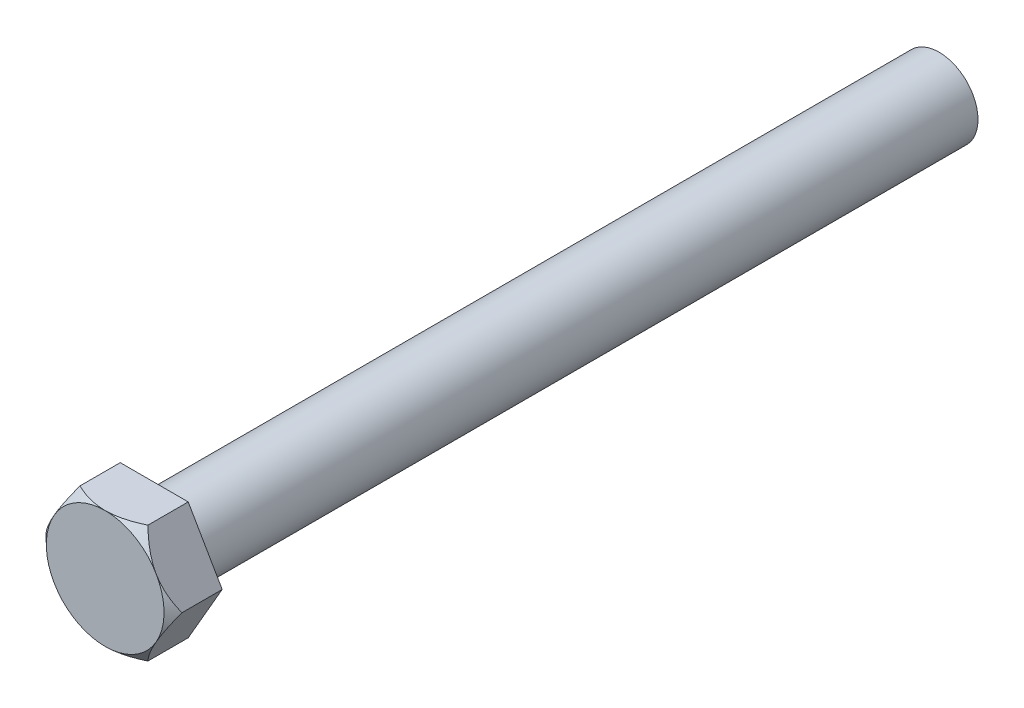
ISO-10303-21;
HEADER;
FILE_DESCRIPTION(('STEP AP214'),'2;1');
FILE_NAME('part.step','',(''),(''),'','','');
FILE_SCHEMA(('AUTOMOTIVE_DESIGN { 1 0 10303 214 1 1 1 1 }'));
ENDSEC;
DATA;
#1=APPLICATION_CONTEXT('core data for automotive mechanical design processes');
#2=APPLICATION_PROTOCOL_DEFINITION('international standard','automotive_design',2000,#1);
#3=PRODUCT_CONTEXT('',#1,'mechanical');
#4=PRODUCT('Part','Part','',(#3));
#5=PRODUCT_RELATED_PRODUCT_CATEGORY('part','',(#4));
#6=PRODUCT_DEFINITION_FORMATION('','',#4);
#7=PRODUCT_DEFINITION_CONTEXT('part definition',#1,'design');
#8=PRODUCT_DEFINITION('design','',#6,#7);
#9=PRODUCT_DEFINITION_SHAPE('','',#8);
#10=(LENGTH_UNIT() NAMED_UNIT(*) SI_UNIT(.MILLI.,.METRE.));
#11=(NAMED_UNIT(*) PLANE_ANGLE_UNIT() SI_UNIT($,.RADIAN.));
#12=(NAMED_UNIT(*) SI_UNIT($,.STERADIAN.) SOLID_ANGLE_UNIT());
#13=UNCERTAINTY_MEASURE_WITH_UNIT(LENGTH_MEASURE(1.E-05),#10,'distance_accuracy_value','');
#14=(GEOMETRIC_REPRESENTATION_CONTEXT(3) GLOBAL_UNCERTAINTY_ASSIGNED_CONTEXT((#13)) GLOBAL_UNIT_ASSIGNED_CONTEXT((#10,
#11,#12)) REPRESENTATION_CONTEXT('',''));
#15=CARTESIAN_POINT('',(0.,0.,0.));
#16=DIRECTION('',(0.,0.,1.));
#17=DIRECTION('',(1.,0.,0.));
#18=AXIS2_PLACEMENT_3D('',#15,#16,#17);
#19=CARTESIAN_POINT('',(6.92820323027552,-12.,170.));
#20=DIRECTION('',(-0.866025403784439,0.5,0.));
#21=DIRECTION('',(-0.5,-0.866025403784439,0.));
#22=AXIS2_PLACEMENT_3D('',#19,#20,#21);
#23=PLANE('',#22);
#24=CARTESIAN_POINT('',(6.92808776022168,-12.0002,168.207177610038));
#25=CARTESIAN_POINT('',(7.05087001299984,-11.7875348999205,168.325729546983));
#26=CARTESIAN_POINT('',(7.17459054592487,-11.5732446509548,168.440500104371));
#27=CARTESIAN_POINT('',(7.42404993886838,-11.1411683079514,168.661273699565));
#28=CARTESIAN_POINT('',(7.54978987656138,-10.9233803473265,168.767271856794));
#29=CARTESIAN_POINT('',(7.80400293306077,-10.4830704175222,168.969726409275));
#30=CARTESIAN_POINT('',(7.93248740222282,-10.26052878895,169.066126145696));
#31=CARTESIAN_POINT('',(8.19148908269136,-9.81192471913279,169.247228171248));
#32=CARTESIAN_POINT('',(8.32200597250958,-9.58586283472178,169.33193228989));
#33=CARTESIAN_POINT('',(8.58288800793269,-9.13400189458696,169.486857477345));
#34=CARTESIAN_POINT('',(8.71322149491538,-8.90825767320533,169.557290549802));
#35=CARTESIAN_POINT('',(8.97560825981543,-8.45379046516481,169.683880327818));
#36=CARTESIAN_POINT('',(9.10766135418737,-8.22506779641592,169.74003854411));
#37=CARTESIAN_POINT('',(9.37290127394448,-7.76565877920112,169.836620557546));
#38=CARTESIAN_POINT('',(9.5060848891701,-7.53497799089464,169.877079389886));
#39=CARTESIAN_POINT('',(9.77344868899965,-7.07189030548519,169.941337735658));
#40=CARTESIAN_POINT('',(9.90762873430441,-6.83948364965544,169.965139535));
#41=CARTESIAN_POINT('',(10.1405120917843,-6.43611784226304,169.991356233011));
#42=CARTESIAN_POINT('',(10.2391064268982,-6.26534744450722,169.997788383698));
#43=CARTESIAN_POINT('',(10.4363455583565,-5.92371924758081,170.001252755064));
#44=CARTESIAN_POINT('',(10.5349903576166,-5.7528614433598,169.998284351577));
#45=CARTESIAN_POINT('',(10.7321275696726,-5.41140977601644,169.982987710216));
#46=CARTESIAN_POINT('',(10.8306199286678,-5.24081600607944,169.970656699812));
#47=CARTESIAN_POINT('',(11.0272146701379,-4.90030392535227,169.936836945066));
#48=CARTESIAN_POINT('',(11.1253170065454,-4.73038569435331,169.915347149576));
#49=CARTESIAN_POINT('',(11.4189264840233,-4.22183916177778,169.837549839052));
#50=CARTESIAN_POINT('',(11.6135815060493,-3.88468677368039,169.767927203115));
#51=CARTESIAN_POINT('',(11.999290278374,-3.21661958308889,169.597054888879));
#52=CARTESIAN_POINT('',(12.1903443843722,-2.88570416450543,169.495808351943));
#53=CARTESIAN_POINT('',(12.5064490392381,-2.33819484176873,169.30387990913));
#54=CARTESIAN_POINT('',(12.6326424708313,-2.11962140666769,169.220579994964));
#55=CARTESIAN_POINT('',(12.8830943562106,-1.6858260163394,169.04315927892));
#56=CARTESIAN_POINT('',(13.0073530357845,-1.47060367003597,168.949039750614));
#57=CARTESIAN_POINT('',(13.253503394551,-1.04425874235103,168.751656153364));
#58=CARTESIAN_POINT('',(13.3754020440447,-0.833124088053984,168.648426622953));
#59=CARTESIAN_POINT('',(13.6173347865059,-0.414084286096656,168.433710650121));
#60=CARTESIAN_POINT('',(13.7373693355508,-0.206178348487363,168.322226267126));
#61=CARTESIAN_POINT('',(13.8565219306049,0.000200000000005602,168.207177610038));
#62=B_SPLINE_CURVE_WITH_KNOTS('',3,(#24,#25,#26,#27,#28,#29,#30,#31,#32,#33,#34,#35,#36,#37,#38,
#39,#40,#41,#42,#43,#44,#45,#46,#47,#48,#49,#50,#51,#52,#53,#54,#55,#56,#57,#58,#59,#60,#61),
.UNSPECIFIED.,.F.,.F.,(4,2,2,2,2,2,2,2,2,2,2,2,2,2,2,2,2,2,4),(0.,0.818087409395662,
1.63662694915712,2.45974274618354,3.28272963931715,4.09241162198263,4.90200787883344,
5.70978688161754,6.51745500800844,7.10912570284194,7.70083568348206,8.29272095437571,
8.88467417389757,10.0695053785687,11.2542189253583,12.0513090708619,12.8483054870288,
13.6424004016194,14.4362978680748),.UNSPECIFIED.);
#63=CARTESIAN_POINT('',(6.92820323027552,-12.,168.207289119567));
#64=VERTEX_POINT('',#63);
#65=CARTESIAN_POINT('',(10.3923048454133,-6.,170.));
#66=VERTEX_POINT('',#65);
#67=EDGE_CURVE('E170',#64,#66,#62,.T.);
#68=ORIENTED_EDGE('',*,*,#67,.F.);
#69=DIRECTION('',(0.,0.,-1.));
#70=VECTOR('',#69,1.);
#71=CARTESIAN_POINT('',(6.92820323027552,-12.,170.));
#72=LINE('',#71,#70);
#73=CARTESIAN_POINT('',(6.92820323027552,-12.,160.));
#74=VERTEX_POINT('',#73);
#75=EDGE_CURVE('E189',#64,#74,#72,.T.);
#76=ORIENTED_EDGE('',*,*,#75,.T.);
#77=DIRECTION('',(0.5,0.866025403784439,0.));
#78=VECTOR('',#77,1.);
#79=CARTESIAN_POINT('',(6.92820323027552,-12.,160.));
#80=LINE('',#79,#78);
#81=CARTESIAN_POINT('',(13.856406460551,0.,160.));
#82=VERTEX_POINT('',#81);
#83=EDGE_CURVE('E172',#74,#82,#80,.T.);
#84=ORIENTED_EDGE('',*,*,#83,.T.);
#85=DIRECTION('',(0.,0.,-1.));
#86=VECTOR('',#85,1.);
#87=CARTESIAN_POINT('',(13.856406460551,0.,170.));
#88=LINE('',#87,#86);
#89=CARTESIAN_POINT('',(13.856406460551,0.,168.207289119567));
#90=VERTEX_POINT('',#89);
#91=EDGE_CURVE('E198',#90,#82,#88,.T.);
#92=ORIENTED_EDGE('',*,*,#91,.F.);
#93=EDGE_CURVE('E165',#66,#90,#62,.T.);
#94=ORIENTED_EDGE('',*,*,#93,.F.);
#95=EDGE_LOOP('',(#68,#76,#84,#92,#94));
#96=FACE_BOUND('',#95,.T.);
#97=ADVANCED_FACE('F33',(#96),#23,.F.);
#98=CARTESIAN_POINT('',(13.856406460551,0.,170.));
#99=DIRECTION('',(-0.866025403784438,-0.5,0.));
#100=DIRECTION('',(0.5,-0.866025403784438,0.));
#101=AXIS2_PLACEMENT_3D('',#98,#99,#100);
#102=PLANE('',#101);
#103=CARTESIAN_POINT('',(13.8565219306049,-0.000200000000006842,168.207177610038));
#104=CARTESIAN_POINT('',(13.7337396778267,0.212465100079519,168.325729546983));
#105=CARTESIAN_POINT('',(13.6100191449017,0.426755349045171,168.440500104371));
#106=CARTESIAN_POINT('',(13.3605597519582,0.858831692048625,168.661273699565));
#107=CARTESIAN_POINT('',(13.2348198142652,1.07661965267345,168.767271856794));
#108=CARTESIAN_POINT('',(12.9806067577658,1.51692958247778,168.969726409275));
#109=CARTESIAN_POINT('',(12.8521222886037,1.73947121104996,169.066126145696));
#110=CARTESIAN_POINT('',(12.5931206081352,2.1880752808672,169.247228171248));
#111=CARTESIAN_POINT('',(12.462603718317,2.41413716527821,169.33193228989));
#112=CARTESIAN_POINT('',(12.2017216828938,2.86599810541303,169.486857477345));
#113=CARTESIAN_POINT('',(12.0713881959112,3.09174232679466,169.557290549802));
#114=CARTESIAN_POINT('',(11.8090014310111,3.54620953483518,169.683880327818));
#115=CARTESIAN_POINT('',(11.6769483366392,3.77493220358407,169.74003854411));
#116=CARTESIAN_POINT('',(11.4117084168821,4.23434122079888,169.836620557546));
#117=CARTESIAN_POINT('',(11.2785248016564,4.46502200910536,169.877079389886));
#118=CARTESIAN_POINT('',(11.0111610018269,4.92810969451481,169.941337735658));
#119=CARTESIAN_POINT('',(10.8769809565221,5.16051635034456,169.965139535));
#120=CARTESIAN_POINT('',(10.6440975990422,5.56388215773696,169.991356233011));
#121=CARTESIAN_POINT('',(10.5455032639283,5.73465255549278,169.997788383698));
#122=CARTESIAN_POINT('',(10.3482641324701,6.07628075241919,170.001252755064));
#123=CARTESIAN_POINT('',(10.2496193332099,6.24713855664019,169.998284351577));
#124=CARTESIAN_POINT('',(10.052482121154,6.58859022398356,169.982987710216));
#125=CARTESIAN_POINT('',(9.95398976215877,6.75918399392056,169.970656699812));
#126=CARTESIAN_POINT('',(9.75739502068862,7.09969607464773,169.936836945066));
#127=CARTESIAN_POINT('',(9.65929268428115,7.26961430564668,169.915347149576));
#128=CARTESIAN_POINT('',(9.36568320680322,7.77816083822222,169.837549839052));
#129=CARTESIAN_POINT('',(9.17102818477726,8.11531322631961,169.767927203115));
#130=CARTESIAN_POINT('',(8.7853194124525,8.78338041691111,169.597054888879));
#131=CARTESIAN_POINT('',(8.59426530645435,9.11429583549456,169.495808351943));
#132=CARTESIAN_POINT('',(8.27816065158848,9.66180515823126,169.30387990913));
#133=CARTESIAN_POINT('',(8.15196721999519,9.88037859333231,169.220579994964));
#134=CARTESIAN_POINT('',(7.90151533461593,10.3141739836606,169.04315927892));
#135=CARTESIAN_POINT('',(7.77725665504203,10.529396329964,168.949039750615));
#136=CARTESIAN_POINT('',(7.5311062962755,10.955741257649,168.751656153364));
#137=CARTESIAN_POINT('',(7.40920764678184,11.166875911946,168.648426622953));
#138=CARTESIAN_POINT('',(7.16727490432061,11.5859157139033,168.433710650121));
#139=CARTESIAN_POINT('',(7.04724035527576,11.7938216515126,168.322226267126));
#140=CARTESIAN_POINT('',(6.92808776022167,12.0002,168.207177610038));
#141=B_SPLINE_CURVE_WITH_KNOTS('',3,(#103,#104,#105,#106,#107,#108,#109,#110,#111,#112,#113,
#114,#115,#116,#117,#118,#119,#120,#121,#122,#123,#124,#125,#126,#127,#128,#129,#130,#131,#132,
#133,#134,#135,#136,#137,#138,#139,#140),.UNSPECIFIED.,.F.,.F.,(4,2,2,2,2,2,2,2,2,2,2,2,2,2,2,2,
2,2,4),(0.,0.818087409395676,1.63662694915714,2.45974274618355,3.28272963931717,
4.09241162198265,4.90200787883346,5.70978688161756,6.51745500800847,7.10912570284197,
7.70083568348208,8.29272095437573,8.88467417389759,10.0695053785687,11.2542189253583,
12.0513090708619,12.8483054870288,13.6424004016194,14.4362978680748),.UNSPECIFIED.);
#142=CARTESIAN_POINT('',(10.3923048454133,6.,170.));
#143=VERTEX_POINT('',#142);
#144=EDGE_CURVE('E171',#90,#143,#141,.T.);
#145=ORIENTED_EDGE('',*,*,#144,.F.);
#146=ORIENTED_EDGE('',*,*,#91,.T.);
#147=DIRECTION('',(-0.5,0.866025403784439,0.));
#148=VECTOR('',#147,1.);
#149=CARTESIAN_POINT('',(13.856406460551,0.,160.));
#150=LINE('',#149,#148);
#151=CARTESIAN_POINT('',(6.9282032302755,12.,160.));
#152=VERTEX_POINT('',#151);
#153=EDGE_CURVE('E175',#82,#152,#150,.T.);
#154=ORIENTED_EDGE('',*,*,#153,.T.);
#155=DIRECTION('',(0.,0.,-1.));
#156=VECTOR('',#155,1.);
#157=CARTESIAN_POINT('',(6.9282032302755,12.,170.));
#158=LINE('',#157,#156);
#159=CARTESIAN_POINT('',(6.92820323027551,12.,168.207289119567));
#160=VERTEX_POINT('',#159);
#161=EDGE_CURVE('E196',#160,#152,#158,.T.);
#162=ORIENTED_EDGE('',*,*,#161,.F.);
#163=EDGE_CURVE('E109',#143,#160,#141,.T.);
#164=ORIENTED_EDGE('',*,*,#163,.F.);
#165=EDGE_LOOP('',(#145,#146,#154,#162,#164));
#166=FACE_BOUND('',#165,.T.);
#167=ADVANCED_FACE('F154',(#166),#102,.F.);
#168=CARTESIAN_POINT('',(6.9282032302755,12.,170.));
#169=DIRECTION('',(0.,-1.,0.));
#170=DIRECTION('',(0.,0.,-1.));
#171=AXIS2_PLACEMENT_3D('',#168,#169,#170);
#172=PLANE('',#171);
#173=CARTESIAN_POINT('',(-17.2429105362062,12.,161.301491533726));
#174=CARTESIAN_POINT('',(-17.0230654007389,12.,161.475744655455));
#175=CARTESIAN_POINT('',(-16.8026944880091,12.,161.649334249678));
#176=CARTESIAN_POINT('',(-16.3607959575137,12.,161.995041135547));
#177=CARTESIAN_POINT('',(-16.1392683230899,12.,162.167158405894));
#178=CARTESIAN_POINT('',(-15.4726945958689,12.,162.681159267231));
#179=CARTESIAN_POINT('',(-15.0257640195892,12.,163.020607399545));
#180=CARTESIAN_POINT('',(-14.1210091275293,12.,163.695136903427));
#181=CARTESIAN_POINT('',(-13.6631191836772,12.,164.030130488567));
#182=CARTESIAN_POINT('',(-12.740002807525,12.,164.689779507659));
#183=CARTESIAN_POINT('',(-12.274777073298,12.,165.014435916524));
#184=CARTESIAN_POINT('',(-11.2940434821539,12.,165.678638448745));
#185=CARTESIAN_POINT('',(-10.7777131780295,12.,166.016981167017));
#186=CARTESIAN_POINT('',(-9.99338220617273,12.,166.509030328677));
#187=CARTESIAN_POINT('',(-9.73024588779131,12.,166.670499859634));
#188=CARTESIAN_POINT('',(-9.20036615979346,12.,166.987402039214));
#189=CARTESIAN_POINT('',(-8.93362289923153,12.,167.142834936276));
#190=CARTESIAN_POINT('',(-8.39737087410437,12.,167.445991105209));
#191=CARTESIAN_POINT('',(-8.12788006279748,12.,167.593746053303));
#192=CARTESIAN_POINT('',(-7.58456793292534,12.,167.881130169707));
#193=CARTESIAN_POINT('',(-7.31074640273404,12.,168.020758939352));
#194=CARTESIAN_POINT('',(-6.75863581577218,12.,168.290394710653));
#195=CARTESIAN_POINT('',(-6.48035015582675,12.,168.420408641688));
#196=CARTESIAN_POINT('',(-5.91884712798655,12.,168.669293210322));
#197=CARTESIAN_POINT('',(-5.63563031737663,12.,168.78816509755));
#198=CARTESIAN_POINT('',(-5.14153542995023,12.,168.982448769121));
#199=CARTESIAN_POINT('',(-4.9318575656623,12.,169.060907064306));
#200=CARTESIAN_POINT('',(-4.5097979871303,12.,169.21012136778));
#201=CARTESIAN_POINT('',(-4.29741630321723,12.,169.280877462387));
#202=CARTESIAN_POINT('',(-3.6561382908586,12.,169.480367820196));
#203=CARTESIAN_POINT('',(-3.22309104826955,12.,169.596331359121));
#204=CARTESIAN_POINT('',(-2.57167045165792,12.,169.738594289604));
#205=CARTESIAN_POINT('',(-2.35660565005915,12.,169.780440504566));
#206=CARTESIAN_POINT('',(-1.92471283630375,12.,169.853681354369));
#207=CARTESIAN_POINT('',(-1.7078851109348,12.,169.885077655653));
#208=CARTESIAN_POINT('',(-1.27293322883777,12.,169.936847844648));
#209=CARTESIAN_POINT('',(-1.05480917907265,12.,169.957222629348));
#210=CARTESIAN_POINT('',(-0.617791952392422,12.,169.986562095451));
#211=CARTESIAN_POINT('',(-0.39889878850552,12.,169.995526969204));
#212=CARTESIAN_POINT('',(0.0268722852880935,12.,170.001691686882));
#213=CARTESIAN_POINT('',(0.233741338121393,12.,169.999518151605));
#214=CARTESIAN_POINT('',(0.647136373247969,12.,169.984876229417));
#215=CARTESIAN_POINT('',(0.853662314712774,12.,169.972406694544));
#216=CARTESIAN_POINT('',(1.26584178037309,12.,169.937390477829));
#217=CARTESIAN_POINT('',(1.47149536607799,12.,169.914844518807));
#218=CARTESIAN_POINT('',(1.88151745783615,12.,169.860062207237));
#219=CARTESIAN_POINT('',(2.0858857868345,12.,169.827824548189));
#220=CARTESIAN_POINT('',(2.70432253291109,12.,169.71588742995));
#221=CARTESIAN_POINT('',(3.11582398623192,12.,169.621660543861));
#222=CARTESIAN_POINT('',(3.92963119940282,12.,169.400323167409));
#223=CARTESIAN_POINT('',(4.3319374571061,12.,169.273214461969));
#224=CARTESIAN_POINT('',(5.17194507250102,12.,168.975785335791));
#225=CARTESIAN_POINT('',(5.60847946119779,12.,168.802197394488));
#226=CARTESIAN_POINT('',(6.47000247224792,12.,168.428201778055));
#227=CARTESIAN_POINT('',(6.89498510732763,12.,168.227780502473));
#228=CARTESIAN_POINT('',(7.73571316942576,12.,167.805210092112));
#229=CARTESIAN_POINT('',(8.15142262219497,12.,167.582989979678));
#230=CARTESIAN_POINT('',(8.97337286530146,12.,167.121952892666));
#231=CARTESIAN_POINT('',(9.37961530508665,12.,166.883138838579));
#232=CARTESIAN_POINT('',(10.161974779922,12.,166.405777479206));
#233=CARTESIAN_POINT('',(10.5385227525068,12.,166.167932674489));
#234=CARTESIAN_POINT('',(11.2854247180178,12.,165.682679856703));
#235=CARTESIAN_POINT('',(11.6557782428027,12.,165.435271125484));
#236=CARTESIAN_POINT('',(12.3880355551045,12.,164.934763966653));
#237=CARTESIAN_POINT('',(12.7499842567705,12.,164.681731094201));
#238=CARTESIAN_POINT('',(13.2894547603963,12.,164.297449247485));
#239=CARTESIAN_POINT('',(13.4686809218622,12.,164.168582744604));
#240=CARTESIAN_POINT('',(13.8260743383211,12.,163.909396295529));
#241=CARTESIAN_POINT('',(14.0042416130839,12.,163.779076376602));
#242=CARTESIAN_POINT('',(14.1819210918129,12.,163.648094245245));
#243=B_SPLINE_CURVE_WITH_KNOTS('',3,(#173,#174,#175,#176,#177,#178,#179,#180,#181,#182,#183,
#184,#185,#186,#187,#188,#189,#190,#191,#192,#193,#194,#195,#196,#197,#198,#199,#200,#201,#202,
#203,#204,#205,#206,#207,#208,#209,#210,#211,#212,#213,#214,#215,#216,#217,#218,#219,#220,#221,
#222,#223,#224,#225,#226,#227,#228,#229,#230,#231,#232,#233,#234,#235,#236,#237,#238,#239,#240,
#241,#242),.UNSPECIFIED.,.F.,.F.,(4,2,2,2,2,2,2,2,2,2,2,2,2,2,2,2,2,2,2,2,2,2,2,2,2,2,2,2,2,2,2,
2,2,2,4),(0.,0.841582231394053,1.6831766163044,3.36677284325677,5.06870007370247,
6.77046631477211,8.6219702903688,9.54809139671202,10.4741743479685,11.396070776635,
12.3180123949849,13.2392829639769,14.160450084521,14.8319323083065,15.5034070061466,
16.8462985076073,17.5033899991257,18.1603766543157,18.8173098323935,19.4742319356634,
20.0946170422926,20.7150713286463,21.3354811145823,21.9559745730507,23.2206565449784,
24.4852698805562,25.8934553295554,27.3023572373361,28.7160092834415,30.1294131575496,
31.4653652138122,32.8014177817205,34.1262062146977,34.7884369282127,35.4506552384997),.UNSPECIFIED.);
#244=CARTESIAN_POINT('',(0.,12.,170.));
#245=VERTEX_POINT('',#244);
#246=EDGE_CURVE('E105',#160,#245,#243,.F.);
#247=ORIENTED_EDGE('',*,*,#246,.F.);
#248=ORIENTED_EDGE('',*,*,#161,.T.);
#249=DIRECTION('',(-1.,0.,0.));
#250=VECTOR('',#249,1.);
#251=CARTESIAN_POINT('',(6.9282032302755,12.,160.));
#252=LINE('',#251,#250);
#253=CARTESIAN_POINT('',(-6.92820323027551,12.,160.));
#254=VERTEX_POINT('',#253);
#255=EDGE_CURVE('E178',#152,#254,#252,.T.);
#256=ORIENTED_EDGE('',*,*,#255,.T.);
#257=DIRECTION('',(0.,0.,-1.));
#258=VECTOR('',#257,1.);
#259=CARTESIAN_POINT('',(-6.92820323027551,12.,170.));
#260=LINE('',#259,#258);
#261=CARTESIAN_POINT('',(-6.92820323027551,12.,168.207289119567));
#262=VERTEX_POINT('',#261);
#263=EDGE_CURVE('E129',#262,#254,#260,.T.);
#264=ORIENTED_EDGE('',*,*,#263,.F.);
#265=EDGE_CURVE('E113',#245,#262,#243,.F.);
#266=ORIENTED_EDGE('',*,*,#265,.F.);
#267=EDGE_LOOP('',(#247,#248,#256,#264,#266));
#268=FACE_BOUND('',#267,.T.);
#269=ADVANCED_FACE('F127',(#268),#172,.F.);
#270=CARTESIAN_POINT('',(-6.92820323027551,12.,170.));
#271=DIRECTION('',(0.866025403784439,-0.5,0.));
#272=DIRECTION('',(0.5,0.866025403784439,0.));
#273=AXIS2_PLACEMENT_3D('',#270,#271,#272);
#274=PLANE('',#273);
#275=CARTESIAN_POINT('',(-6.92808776022167,12.0002,168.207177610038));
#276=CARTESIAN_POINT('',(-7.05087001299982,11.7875348999205,168.325729546983));
#277=CARTESIAN_POINT('',(-7.17459054592485,11.5732446509548,168.440500104371));
#278=CARTESIAN_POINT('',(-7.42404993886837,11.1411683079514,168.661273699565));
#279=CARTESIAN_POINT('',(-7.54978987656137,10.9233803473266,168.767271856794));
#280=CARTESIAN_POINT('',(-7.80400293306076,10.4830704175222,168.969726409275));
#281=CARTESIAN_POINT('',(-7.93248740222281,10.26052878895,169.066126145696));
#282=CARTESIAN_POINT('',(-8.19148908269135,9.81192471913281,169.247228171248));
#283=CARTESIAN_POINT('',(-8.32200597250957,9.58586283472179,169.33193228989));
#284=CARTESIAN_POINT('',(-8.58288800793268,9.13400189458697,169.486857477345));
#285=CARTESIAN_POINT('',(-8.71322149491537,8.90825767320535,169.557290549802));
#286=CARTESIAN_POINT('',(-8.97560825981542,8.45379046516482,169.683880327818));
#287=CARTESIAN_POINT('',(-9.10766135418736,8.22506779641594,169.74003854411));
#288=CARTESIAN_POINT('',(-9.37290127394447,7.76565877920113,169.836620557546));
#289=CARTESIAN_POINT('',(-9.50608488917009,7.53497799089465,169.877079389886));
#290=CARTESIAN_POINT('',(-9.77344868899964,7.0718903054852,169.941337735658));
#291=CARTESIAN_POINT('',(-9.9076287343044,6.83948364965545,169.965139535));
#292=CARTESIAN_POINT('',(-10.1405120917843,6.43611784226305,169.991356233011));
#293=CARTESIAN_POINT('',(-10.2391064268982,6.26534744450723,169.997788383698));
#294=CARTESIAN_POINT('',(-10.4363455583565,5.92371924758082,170.001252755064));
#295=CARTESIAN_POINT('',(-10.5349903576166,5.75286144335981,169.998284351577));
#296=CARTESIAN_POINT('',(-10.7321275696726,5.41140977601645,169.982987710216));
#297=CARTESIAN_POINT('',(-10.8306199286678,5.24081600607945,169.970656699812));
#298=CARTESIAN_POINT('',(-11.0272146701379,4.90030392535228,169.936836945066));
#299=CARTESIAN_POINT('',(-11.1253170065454,4.73038569435332,169.915347149576));
#300=CARTESIAN_POINT('',(-11.4189264840233,4.22183916177779,169.837549839052));
#301=CARTESIAN_POINT('',(-11.6135815060493,3.8846867736804,169.767927203115));
#302=CARTESIAN_POINT('',(-11.999290278374,3.2166195830889,169.597054888879));
#303=CARTESIAN_POINT('',(-12.1903443843722,2.88570416450544,169.495808351943));
#304=CARTESIAN_POINT('',(-12.506449039238,2.33819484176874,169.30387990913));
#305=CARTESIAN_POINT('',(-12.6326424708313,2.1196214066677,169.220579994964));
#306=CARTESIAN_POINT('',(-12.8830943562106,1.6858260163394,169.04315927892));
#307=CARTESIAN_POINT('',(-13.0073530357845,1.47060367003598,168.949039750614));
#308=CARTESIAN_POINT('',(-13.253503394551,1.04425874235103,168.751656153364));
#309=CARTESIAN_POINT('',(-13.3754020440447,0.833124088053984,168.648426622953));
#310=CARTESIAN_POINT('',(-13.6173347865059,0.414084286096654,168.433710650121));
#311=CARTESIAN_POINT('',(-13.7373693355508,0.206178348487361,168.322226267126));
#312=CARTESIAN_POINT('',(-13.8565219306049,-0.000200000000006969,168.207177610038));
#313=B_SPLINE_CURVE_WITH_KNOTS('',3,(#275,#276,#277,#278,#279,#280,#281,#282,#283,#284,#285,
#286,#287,#288,#289,#290,#291,#292,#293,#294,#295,#296,#297,#298,#299,#300,#301,#302,#303,#304,
#305,#306,#307,#308,#309,#310,#311,#312),.UNSPECIFIED.,.F.,.F.,(4,2,2,2,2,2,2,2,2,2,2,2,2,2,2,2,
2,2,4),(0.,0.818087409395675,1.63662694915714,2.45974274618355,3.28272963931716,
4.09241162198264,4.90200787883345,5.70978688161756,6.51745500800846,7.10912570284196,
7.70083568348208,8.29272095437573,8.88467417389759,10.0695053785687,11.2542189253583,
12.0513090708619,12.8483054870289,13.6424004016194,14.4362978680749),.UNSPECIFIED.);
#314=CARTESIAN_POINT('',(-10.3923048454133,6.,170.));
#315=VERTEX_POINT('',#314);
#316=EDGE_CURVE('E118',#262,#315,#313,.T.);
#317=ORIENTED_EDGE('',*,*,#316,.F.);
#318=ORIENTED_EDGE('',*,*,#263,.T.);
#319=DIRECTION('',(-0.5,-0.866025403784439,0.));
#320=VECTOR('',#319,1.);
#321=CARTESIAN_POINT('',(-6.92820323027551,12.,160.));
#322=LINE('',#321,#320);
#323=CARTESIAN_POINT('',(-13.856406460551,0.,160.));
#324=VERTEX_POINT('',#323);
#325=EDGE_CURVE('E180',#254,#324,#322,.T.);
#326=ORIENTED_EDGE('',*,*,#325,.T.);
#327=DIRECTION('',(0.,0.,-1.));
#328=VECTOR('',#327,1.);
#329=CARTESIAN_POINT('',(-13.856406460551,0.,170.));
#330=LINE('',#329,#328);
#331=CARTESIAN_POINT('',(-13.856406460551,0.,168.207289119567));
#332=VERTEX_POINT('',#331);
#333=EDGE_CURVE('E193',#332,#324,#330,.T.);
#334=ORIENTED_EDGE('',*,*,#333,.F.);
#335=EDGE_CURVE('E130',#315,#332,#313,.T.);
#336=ORIENTED_EDGE('',*,*,#335,.F.);
#337=EDGE_LOOP('',(#317,#318,#326,#334,#336));
#338=FACE_BOUND('',#337,.T.);
#339=ADVANCED_FACE('F153',(#338),#274,.F.);
#340=CARTESIAN_POINT('',(-13.856406460551,0.,170.));
#341=DIRECTION('',(0.866025403784438,0.5,0.));
#342=DIRECTION('',(-0.5,0.866025403784438,0.));
#343=AXIS2_PLACEMENT_3D('',#340,#341,#342);
#344=PLANE('',#343);
#345=CARTESIAN_POINT('',(-13.8565219306049,0.000200000000007478,168.207177610038));
#346=CARTESIAN_POINT('',(-13.7337396778267,-0.212465100079517,168.325729546983));
#347=CARTESIAN_POINT('',(-13.6100191449017,-0.426755349045169,168.440500104371));
#348=CARTESIAN_POINT('',(-13.3605597519582,-0.858831692048624,168.661273699565));
#349=CARTESIAN_POINT('',(-13.2348198142652,-1.07661965267345,168.767271856794));
#350=CARTESIAN_POINT('',(-12.9806067577658,-1.51692958247777,168.969726409275));
#351=CARTESIAN_POINT('',(-12.8521222886037,-1.73947121104995,169.066126145696));
#352=CARTESIAN_POINT('',(-12.5931206081352,-2.18807528086719,169.247228171248));
#353=CARTESIAN_POINT('',(-12.462603718317,-2.41413716527821,169.33193228989));
#354=CARTESIAN_POINT('',(-12.2017216828938,-2.86599810541303,169.486857477345));
#355=CARTESIAN_POINT('',(-12.0713881959112,-3.09174232679466,169.557290549802));
#356=CARTESIAN_POINT('',(-11.8090014310111,-3.54620953483518,169.683880327818));
#357=CARTESIAN_POINT('',(-11.6769483366392,-3.77493220358407,169.74003854411));
#358=CARTESIAN_POINT('',(-11.4117084168821,-4.23434122079888,169.836620557546));
#359=CARTESIAN_POINT('',(-11.2785248016564,-4.46502200910535,169.877079389886));
#360=CARTESIAN_POINT('',(-11.0111610018269,-4.9281096945148,169.941337735658));
#361=CARTESIAN_POINT('',(-10.8769809565221,-5.16051635034455,169.965139535));
#362=CARTESIAN_POINT('',(-10.6440975990422,-5.56388215773696,169.991356233011));
#363=CARTESIAN_POINT('',(-10.5455032639283,-5.73465255549277,169.997788383698));
#364=CARTESIAN_POINT('',(-10.3482641324701,-6.07628075241919,170.001252755064));
#365=CARTESIAN_POINT('',(-10.2496193332099,-6.24713855664019,169.998284351577));
#366=CARTESIAN_POINT('',(-10.052482121154,-6.58859022398356,169.982987710216));
#367=CARTESIAN_POINT('',(-9.95398976215877,-6.75918399392056,169.970656699812));
#368=CARTESIAN_POINT('',(-9.75739502068862,-7.09969607464773,169.936836945066));
#369=CARTESIAN_POINT('',(-9.65929268428115,-7.26961430564668,169.915347149576));
#370=CARTESIAN_POINT('',(-9.36568320680321,-7.77816083822222,169.837549839052));
#371=CARTESIAN_POINT('',(-9.17102818477726,-8.11531322631961,169.767927203115));
#372=CARTESIAN_POINT('',(-8.7853194124525,-8.78338041691111,169.597054888879));
#373=CARTESIAN_POINT('',(-8.59426530645434,-9.11429583549456,169.495808351943));
#374=CARTESIAN_POINT('',(-8.27816065158848,-9.66180515823126,169.30387990913));
#375=CARTESIAN_POINT('',(-8.15196721999519,-9.88037859333231,169.220579994964));
#376=CARTESIAN_POINT('',(-7.90151533461593,-10.3141739836606,169.04315927892));
#377=CARTESIAN_POINT('',(-7.77725665504202,-10.529396329964,168.949039750615));
#378=CARTESIAN_POINT('',(-7.53110629627549,-10.955741257649,168.751656153364));
#379=CARTESIAN_POINT('',(-7.40920764678183,-11.166875911946,168.648426622953));
#380=CARTESIAN_POINT('',(-7.16727490432061,-11.5859157139033,168.433710650121));
#381=CARTESIAN_POINT('',(-7.04724035527576,-11.7938216515126,168.322226267126));
#382=CARTESIAN_POINT('',(-6.92808776022167,-12.0002,168.207177610038));
#383=B_SPLINE_CURVE_WITH_KNOTS('',3,(#345,#346,#347,#348,#349,#350,#351,#352,#353,#354,#355,
#356,#357,#358,#359,#360,#361,#362,#363,#364,#365,#366,#367,#368,#369,#370,#371,#372,#373,#374,
#375,#376,#377,#378,#379,#380,#381,#382),.UNSPECIFIED.,.F.,.F.,(4,2,2,2,2,2,2,2,2,2,2,2,2,2,2,2,
2,2,4),(0.,0.818087409395675,1.63662694915714,2.45974274618354,3.28272963931717,
4.09241162198264,4.90200787883346,5.70978688161756,6.51745500800846,7.10912570284196,
7.70083568348208,8.29272095437573,8.88467417389759,10.0695053785687,11.2542189253583,
12.0513090708619,12.8483054870289,13.6424004016194,14.4362978680748),.UNSPECIFIED.);
#384=CARTESIAN_POINT('',(-10.3923048454133,-6.00000000000001,170.));
#385=VERTEX_POINT('',#384);
#386=EDGE_CURVE('E252',#332,#385,#383,.T.);
#387=ORIENTED_EDGE('',*,*,#386,.F.);
#388=ORIENTED_EDGE('',*,*,#333,.T.);
#389=DIRECTION('',(0.5,-0.866025403784438,0.));
#390=VECTOR('',#389,1.);
#391=CARTESIAN_POINT('',(-13.856406460551,0.,160.));
#392=LINE('',#391,#390);
#393=CARTESIAN_POINT('',(-6.92820323027551,-12.,160.));
#394=VERTEX_POINT('',#393);
#395=EDGE_CURVE('E183',#324,#394,#392,.T.);
#396=ORIENTED_EDGE('',*,*,#395,.T.);
#397=DIRECTION('',(0.,0.,-1.));
#398=VECTOR('',#397,1.);
#399=CARTESIAN_POINT('',(-6.92820323027551,-12.,170.));
#400=LINE('',#399,#398);
#401=CARTESIAN_POINT('',(-6.92820323027551,-12.,168.207289119567));
#402=VERTEX_POINT('',#401);
#403=EDGE_CURVE('E191',#402,#394,#400,.T.);
#404=ORIENTED_EDGE('',*,*,#403,.F.);
#405=EDGE_CURVE('E251',#385,#402,#383,.T.);
#406=ORIENTED_EDGE('',*,*,#405,.F.);
#407=EDGE_LOOP('',(#387,#388,#396,#404,#406));
#408=FACE_BOUND('',#407,.T.);
#409=ADVANCED_FACE('F221',(#408),#344,.F.);
#410=CARTESIAN_POINT('',(-6.92820323027551,-12.,170.));
#411=DIRECTION('',(0.,1.,0.));
#412=DIRECTION('',(0.,0.,1.));
#413=AXIS2_PLACEMENT_3D('',#410,#411,#412);
#414=PLANE('',#413);
#415=CARTESIAN_POINT('',(-17.2429105362062,-12.,161.301491533726));
#416=CARTESIAN_POINT('',(-17.0230654007389,-12.,161.475744655455));
#417=CARTESIAN_POINT('',(-16.8026944880091,-12.,161.649334249678));
#418=CARTESIAN_POINT('',(-16.3607959575137,-12.,161.995041135547));
#419=CARTESIAN_POINT('',(-16.1392683230899,-12.,162.167158405894));
#420=CARTESIAN_POINT('',(-15.4726945958689,-12.,162.681159267231));
#421=CARTESIAN_POINT('',(-15.0257640195892,-12.,163.020607399545));
#422=CARTESIAN_POINT('',(-14.1210091275293,-12.,163.695136903427));
#423=CARTESIAN_POINT('',(-13.6631191836772,-12.,164.030130488567));
#424=CARTESIAN_POINT('',(-12.740002807525,-12.,164.689779507659));
#425=CARTESIAN_POINT('',(-12.2747770732981,-12.,165.014435916524));
#426=CARTESIAN_POINT('',(-11.2940434821539,-12.,165.678638448745));
#427=CARTESIAN_POINT('',(-10.7777131780295,-12.,166.016981167017));
#428=CARTESIAN_POINT('',(-9.99338220617273,-12.,166.509030328677));
#429=CARTESIAN_POINT('',(-9.73024588779131,-12.,166.670499859634));
#430=CARTESIAN_POINT('',(-9.20036615979347,-12.,166.987402039214));
#431=CARTESIAN_POINT('',(-8.93362289923155,-12.,167.142834936276));
#432=CARTESIAN_POINT('',(-8.39737087410439,-12.,167.445991105209));
#433=CARTESIAN_POINT('',(-8.12788006279749,-12.,167.593746053303));
#434=CARTESIAN_POINT('',(-7.58456793292536,-12.,167.881130169707));
#435=CARTESIAN_POINT('',(-7.31074640273407,-12.,168.020758939352));
#436=CARTESIAN_POINT('',(-6.75863581577221,-12.,168.290394710653));
#437=CARTESIAN_POINT('',(-6.48035015582678,-12.,168.420408641688));
#438=CARTESIAN_POINT('',(-5.91884712798658,-12.,168.669293210322));
#439=CARTESIAN_POINT('',(-5.63563031737665,-12.,168.78816509755));
#440=CARTESIAN_POINT('',(-5.14153542995024,-12.,168.982448769121));
#441=CARTESIAN_POINT('',(-4.9318575656623,-12.,169.060907064306));
#442=CARTESIAN_POINT('',(-4.50979798713031,-12.,169.21012136778));
#443=CARTESIAN_POINT('',(-4.29741630321724,-12.,169.280877462387));
#444=CARTESIAN_POINT('',(-3.65613829085861,-12.,169.480367820196));
#445=CARTESIAN_POINT('',(-3.22309104826955,-12.,169.596331359121));
#446=CARTESIAN_POINT('',(-2.57167045165792,-12.,169.738594289604));
#447=CARTESIAN_POINT('',(-2.35660565005914,-12.,169.780440504566));
#448=CARTESIAN_POINT('',(-1.92471283630374,-12.,169.853681354369));
#449=CARTESIAN_POINT('',(-1.7078851109348,-12.,169.885077655653));
#450=CARTESIAN_POINT('',(-1.27293322883776,-12.,169.936847844648));
#451=CARTESIAN_POINT('',(-1.05480917907264,-12.,169.957222629348));
#452=CARTESIAN_POINT('',(-0.617791952392404,-12.,169.986562095451));
#453=CARTESIAN_POINT('',(-0.398898788505501,-12.,169.995526969204));
#454=CARTESIAN_POINT('',(0.0268722852881157,-12.,170.001691686882));
#455=CARTESIAN_POINT('',(0.233741338121417,-12.,169.999518151605));
#456=CARTESIAN_POINT('',(0.647136373247993,-12.,169.984876229417));
#457=CARTESIAN_POINT('',(0.853662314712798,-12.,169.972406694544));
#458=CARTESIAN_POINT('',(1.26584178037311,-12.,169.937390477829));
#459=CARTESIAN_POINT('',(1.47149536607801,-12.,169.914844518807));
#460=CARTESIAN_POINT('',(1.88151745783617,-12.,169.860062207237));
#461=CARTESIAN_POINT('',(2.08588578683453,-12.,169.827824548189));
#462=CARTESIAN_POINT('',(2.70432253291112,-12.,169.71588742995));
#463=CARTESIAN_POINT('',(3.11582398623194,-12.,169.621660543862));
#464=CARTESIAN_POINT('',(3.92963119940283,-12.,169.400323167409));
#465=CARTESIAN_POINT('',(4.33193745710611,-12.,169.273214461969));
#466=CARTESIAN_POINT('',(5.17194507250104,-12.,168.975785335791));
#467=CARTESIAN_POINT('',(5.6084794611978,-12.,168.802197394488));
#468=CARTESIAN_POINT('',(6.47000247224793,-12.,168.428201778055));
#469=CARTESIAN_POINT('',(6.89498510732765,-12.,168.227780502473));
#470=CARTESIAN_POINT('',(7.73571316942579,-12.,167.805210092112));
#471=CARTESIAN_POINT('',(8.151422622195,-12.,167.582989979678));
#472=CARTESIAN_POINT('',(8.97337286530149,-12.,167.121952892666));
#473=CARTESIAN_POINT('',(9.37961530508669,-12.,166.883138838579));
#474=CARTESIAN_POINT('',(10.1619747799221,-12.,166.405777479206));
#475=CARTESIAN_POINT('',(10.5385227525068,-12.,166.167932674489));
#476=CARTESIAN_POINT('',(11.2854247180179,-12.,165.682679856703));
#477=CARTESIAN_POINT('',(11.6557782428027,-12.,165.435271125484));
#478=CARTESIAN_POINT('',(12.3880355551045,-12.,164.934763966653));
#479=CARTESIAN_POINT('',(12.7499842567706,-12.,164.681731094201));
#480=CARTESIAN_POINT('',(13.2894547603963,-12.,164.297449247485));
#481=CARTESIAN_POINT('',(13.4686809218622,-12.,164.168582744604));
#482=CARTESIAN_POINT('',(13.8260743383211,-12.,163.909396295529));
#483=CARTESIAN_POINT('',(14.004241613084,-12.,163.779076376602));
#484=CARTESIAN_POINT('',(14.1819210918129,-12.,163.648094245245));
#485=B_SPLINE_CURVE_WITH_KNOTS('',3,(#415,#416,#417,#418,#419,#420,#421,#422,#423,#424,#425,
#426,#427,#428,#429,#430,#431,#432,#433,#434,#435,#436,#437,#438,#439,#440,#441,#442,#443,#444,
#445,#446,#447,#448,#449,#450,#451,#452,#453,#454,#455,#456,#457,#458,#459,#460,#461,#462,#463,
#464,#465,#466,#467,#468,#469,#470,#471,#472,#473,#474,#475,#476,#477,#478,#479,#480,#481,#482,
#483,#484),.UNSPECIFIED.,.F.,.F.,(4,2,2,2,2,2,2,2,2,2,2,2,2,2,2,2,2,2,2,2,2,2,2,2,2,2,2,2,2,2,2,
2,2,2,4),(0.,0.841582231394045,1.68317661630439,3.36677284325678,5.0687000737025,
6.77046631477211,8.62197029036879,9.54809139671201,10.4741743479685,11.396070776635,
12.3180123949849,13.2392829639769,14.160450084521,14.8319323083065,15.5034070061466,
16.8462985076073,17.5033899991257,18.1603766543158,18.8173098323935,19.4742319356634,
20.0946170422927,20.7150713286463,21.3354811145824,21.9559745730507,23.2206565449784,
24.4852698805562,25.8934553295554,27.3023572373361,28.7160092834415,30.1294131575497,
31.4653652138122,32.8014177817205,34.1262062146978,34.7884369282128,35.4506552384998),.UNSPECIFIED.);
#486=CARTESIAN_POINT('',(0.,-12.,170.));
#487=VERTEX_POINT('',#486);
#488=EDGE_CURVE('E239',#402,#487,#485,.T.);
#489=ORIENTED_EDGE('',*,*,#488,.F.);
#490=ORIENTED_EDGE('',*,*,#403,.T.);
#491=DIRECTION('',(1.,0.,0.));
#492=VECTOR('',#491,1.);
#493=CARTESIAN_POINT('',(-6.92820323027551,-12.,160.));
#494=LINE('',#493,#492);
#495=EDGE_CURVE('E186',#394,#74,#494,.T.);
#496=ORIENTED_EDGE('',*,*,#495,.T.);
#497=ORIENTED_EDGE('',*,*,#75,.F.);
#498=EDGE_CURVE('E124',#487,#64,#485,.T.);
#499=ORIENTED_EDGE('',*,*,#498,.F.);
#500=EDGE_LOOP('',(#489,#490,#496,#497,#499));
#501=FACE_BOUND('',#500,.T.);
#502=ADVANCED_FACE('F216',(#501),#414,.F.);
#503=CARTESIAN_POINT('',(0.,0.,160.));
#504=DIRECTION('',(0.,0.,-1.));
#505=DIRECTION('',(-1.,0.,0.));
#506=AXIS2_PLACEMENT_3D('',#503,#504,#505);
#507=CYLINDRICAL_SURFACE('',#506,7.9375);
#508=CARTESIAN_POINT('',(0.,0.,160.));
#509=DIRECTION('',(0.,0.,1.));
#510=DIRECTION('',(1.,0.,0.));
#511=AXIS2_PLACEMENT_3D('',#508,#509,#510);
#512=CIRCLE('',#511,7.9375);
#513=CARTESIAN_POINT('',(7.9375,0.,160.));
#514=VERTEX_POINT('',#513);
#515=EDGE_CURVE('E201',#514,#514,#512,.T.);
#516=ORIENTED_EDGE('',*,*,#515,.F.);
#517=EDGE_LOOP('',(#516));
#518=FACE_BOUND('',#517,.T.);
#519=CARTESIAN_POINT('',(0.,0.,0.));
#520=DIRECTION('',(0.,0.,1.));
#521=DIRECTION('',(1.,0.,0.));
#522=AXIS2_PLACEMENT_3D('',#519,#520,#521);
#523=CIRCLE('',#522,7.9375);
#524=CARTESIAN_POINT('',(7.9375,0.,0.));
#525=VERTEX_POINT('',#524);
#526=EDGE_CURVE('E200',#525,#525,#523,.T.);
#527=ORIENTED_EDGE('',*,*,#526,.T.);
#528=EDGE_LOOP('',(#527));
#529=FACE_BOUND('',#528,.T.);
#530=ADVANCED_FACE('F35',(#518,#529),#507,.T.);
#531=CARTESIAN_POINT('',(0.,0.,0.));
#532=DIRECTION('',(0.,0.,1.));
#533=DIRECTION('',(1.,0.,0.));
#534=AXIS2_PLACEMENT_3D('',#531,#532,#533);
#535=PLANE('',#534);
#536=ORIENTED_EDGE('',*,*,#526,.F.);
#537=EDGE_LOOP('',(#536));
#538=FACE_BOUND('',#537,.T.);
#539=ADVANCED_FACE('F164',(#538),#535,.F.);
#540=CARTESIAN_POINT('',(0.,0.,160.));
#541=DIRECTION('',(0.,0.,1.));
#542=DIRECTION('',(1.,0.,0.));
#543=AXIS2_PLACEMENT_3D('',#540,#541,#542);
#544=PLANE('',#543);
#545=ORIENTED_EDGE('',*,*,#515,.T.);
#546=EDGE_LOOP('',(#545));
#547=FACE_BOUND('',#546,.T.);
#548=ORIENTED_EDGE('',*,*,#83,.F.);
#549=ORIENTED_EDGE('',*,*,#495,.F.);
#550=ORIENTED_EDGE('',*,*,#395,.F.);
#551=ORIENTED_EDGE('',*,*,#325,.F.);
#552=ORIENTED_EDGE('',*,*,#255,.F.);
#553=ORIENTED_EDGE('',*,*,#153,.F.);
#554=EDGE_LOOP('',(#548,#549,#550,#551,#552,#553));
#555=FACE_BOUND('',#554,.T.);
#556=ADVANCED_FACE('F208',(#547,#555),#544,.F.);
#557=CARTESIAN_POINT('',(0.,0.,170.));
#558=DIRECTION('',(0.,0.,-1.));
#559=DIRECTION('',(1.,0.,0.));
#560=AXIS2_PLACEMENT_3D('',#557,#558,#559);
#561=CONICAL_SURFACE('',#560,12.,0.802851455917392);
#562=ORIENTED_EDGE('',*,*,#93,.T.);
#563=ORIENTED_EDGE('',*,*,#144,.T.);
#564=CARTESIAN_POINT('',(0.,0.,170.));
#565=DIRECTION('',(0.,0.,1.));
#566=DIRECTION('',(1.,0.,0.));
#567=AXIS2_PLACEMENT_3D('',#564,#565,#566);
#568=CIRCLE('',#567,12.);
#569=EDGE_CURVE('E37',#66,#143,#568,.T.);
#570=ORIENTED_EDGE('',*,*,#569,.F.);
#571=EDGE_LOOP('',(#562,#563,#570));
#572=FACE_BOUND('',#571,.T.);
#573=ADVANCED_FACE('F213',(#572),#561,.T.);
#574=ORIENTED_EDGE('',*,*,#67,.T.);
#575=EDGE_CURVE('E248',#487,#66,#568,.T.);
#576=ORIENTED_EDGE('',*,*,#575,.F.);
#577=ORIENTED_EDGE('',*,*,#498,.T.);
#578=EDGE_LOOP('',(#574,#576,#577));
#579=FACE_BOUND('',#578,.T.);
#580=ADVANCED_FACE('F148',(#579),#561,.T.);
#581=ORIENTED_EDGE('',*,*,#405,.T.);
#582=ORIENTED_EDGE('',*,*,#488,.T.);
#583=EDGE_CURVE('E57',#385,#487,#568,.T.);
#584=ORIENTED_EDGE('',*,*,#583,.F.);
#585=EDGE_LOOP('',(#581,#582,#584));
#586=FACE_BOUND('',#585,.T.);
#587=ADVANCED_FACE('F276',(#586),#561,.T.);
#588=ORIENTED_EDGE('',*,*,#335,.T.);
#589=ORIENTED_EDGE('',*,*,#386,.T.);
#590=EDGE_CURVE('E42',#315,#385,#568,.T.);
#591=ORIENTED_EDGE('',*,*,#590,.F.);
#592=EDGE_LOOP('',(#588,#589,#591));
#593=FACE_BOUND('',#592,.T.);
#594=ADVANCED_FACE('F271',(#593),#561,.T.);
#595=ORIENTED_EDGE('',*,*,#265,.T.);
#596=ORIENTED_EDGE('',*,*,#316,.T.);
#597=EDGE_CURVE('E11',#245,#315,#568,.T.);
#598=ORIENTED_EDGE('',*,*,#597,.F.);
#599=EDGE_LOOP('',(#595,#596,#598));
#600=FACE_BOUND('',#599,.T.);
#601=ADVANCED_FACE('F116',(#600),#561,.T.);
#602=ORIENTED_EDGE('',*,*,#163,.T.);
#603=ORIENTED_EDGE('',*,*,#246,.T.);
#604=CARTESIAN_POINT('',(0.,0.,170.));
#605=DIRECTION('',(0.,0.,1.));
#606=DIRECTION('',(1.,0.,0.));
#607=AXIS2_PLACEMENT_3D('',#604,#605,#606);
#608=CIRCLE('',#607,12.);
#609=EDGE_CURVE('E49',#143,#245,#608,.T.);
#610=ORIENTED_EDGE('',*,*,#609,.F.);
#611=EDGE_LOOP('',(#602,#603,#610));
#612=FACE_BOUND('',#611,.T.);
#613=ADVANCED_FACE('F107',(#612),#561,.T.);
#614=CARTESIAN_POINT('',(0.,0.,170.));
#615=DIRECTION('',(0.,0.,1.));
#616=DIRECTION('',(1.,0.,0.));
#617=AXIS2_PLACEMENT_3D('',#614,#615,#616);
#618=PLANE('',#617);
#619=ORIENTED_EDGE('',*,*,#569,.T.);
#620=ORIENTED_EDGE('',*,*,#609,.T.);
#621=ORIENTED_EDGE('',*,*,#597,.T.);
#622=ORIENTED_EDGE('',*,*,#590,.T.);
#623=ORIENTED_EDGE('',*,*,#583,.T.);
#624=ORIENTED_EDGE('',*,*,#575,.T.);
#625=EDGE_LOOP('',(#619,#620,#621,#622,#623,#624));
#626=FACE_BOUND('',#625,.T.);
#627=ADVANCED_FACE('F122',(#626),#618,.T.);
#628=CLOSED_SHELL('',(#97,#167,#269,#339,#409,#502,#530,#539,#556,#573,#580,#587,#594,#601,#613,#627));
#629=MANIFOLD_SOLID_BREP('B2',#628);
#630=ADVANCED_BREP_SHAPE_REPRESENTATION('',(#18,#629),#14);
#631=SHAPE_DEFINITION_REPRESENTATION(#9,#630);
ENDSEC;
END-ISO-10303-21;
